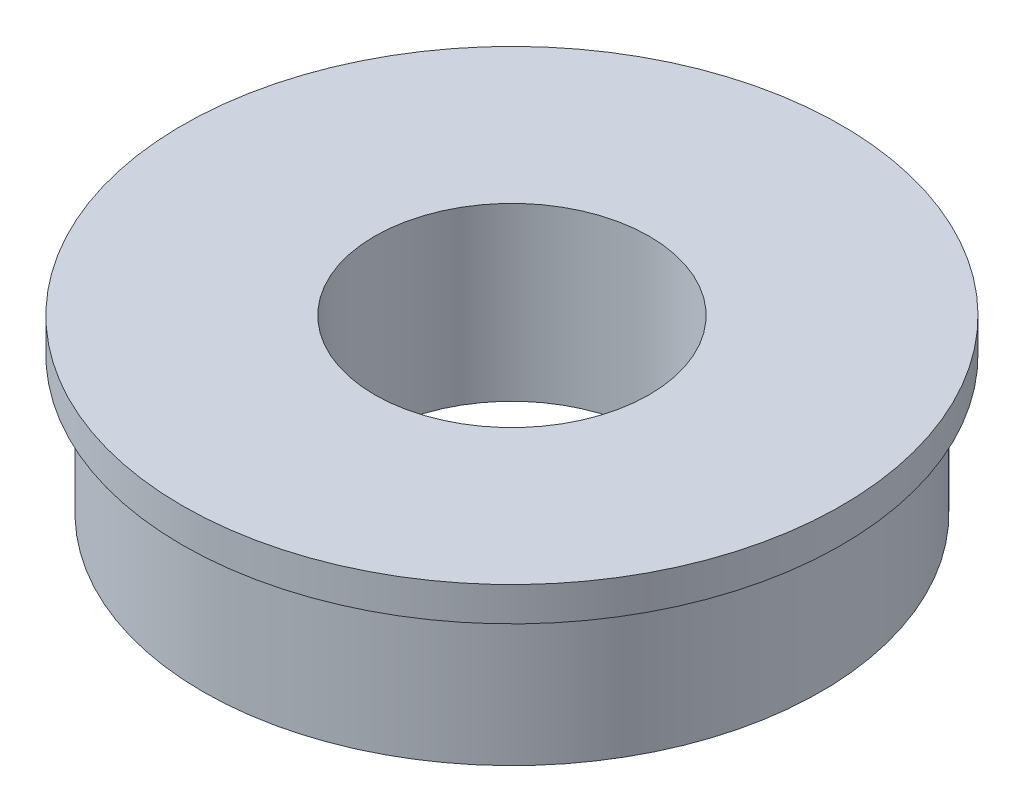
ISO-10303-21;
HEADER;
FILE_DESCRIPTION(('STEP AP214'),'2;1');
FILE_NAME('part.step','',(''),(''),'','','');
FILE_SCHEMA(('AUTOMOTIVE_DESIGN { 1 0 10303 214 1 1 1 1 }'));
ENDSEC;
DATA;
#1=APPLICATION_CONTEXT('core data for automotive mechanical design processes');
#2=APPLICATION_PROTOCOL_DEFINITION('international standard','automotive_design',2000,#1);
#3=PRODUCT_CONTEXT('',#1,'mechanical');
#4=PRODUCT('Part','Part','',(#3));
#5=PRODUCT_RELATED_PRODUCT_CATEGORY('part','',(#4));
#6=PRODUCT_DEFINITION_FORMATION('','',#4);
#7=PRODUCT_DEFINITION_CONTEXT('part definition',#1,'design');
#8=PRODUCT_DEFINITION('design','',#6,#7);
#9=PRODUCT_DEFINITION_SHAPE('','',#8);
#10=(LENGTH_UNIT() NAMED_UNIT(*) SI_UNIT(.MILLI.,.METRE.));
#11=(NAMED_UNIT(*) PLANE_ANGLE_UNIT() SI_UNIT($,.RADIAN.));
#12=(NAMED_UNIT(*) SI_UNIT($,.STERADIAN.) SOLID_ANGLE_UNIT());
#13=UNCERTAINTY_MEASURE_WITH_UNIT(LENGTH_MEASURE(1.E-05),#10,'distance_accuracy_value','');
#14=(GEOMETRIC_REPRESENTATION_CONTEXT(3) GLOBAL_UNCERTAINTY_ASSIGNED_CONTEXT((#13)) GLOBAL_UNIT_ASSIGNED_CONTEXT((#10,
#11,#12)) REPRESENTATION_CONTEXT('',''));
#15=CARTESIAN_POINT('',(0.,0.,0.));
#16=DIRECTION('',(0.,0.,1.));
#17=DIRECTION('',(1.,0.,0.));
#18=AXIS2_PLACEMENT_3D('',#15,#16,#17);
#19=CARTESIAN_POINT('',(0.,0.,0.));
#20=DIRECTION('',(0.,1.,0.));
#21=DIRECTION('',(0.,0.,1.));
#22=AXIS2_PLACEMENT_3D('',#19,#20,#21);
#23=PLANE('',#22);
#24=CARTESIAN_POINT('',(0.,0.,0.));
#25=DIRECTION('',(0.,1.,0.));
#26=DIRECTION('',(0.,0.,1.));
#27=AXIS2_PLACEMENT_3D('',#24,#25,#26);
#28=CIRCLE('',#27,14.2875);
#29=CARTESIAN_POINT('',(0.,0.,14.2875));
#30=VERTEX_POINT('',#29);
#31=EDGE_CURVE('E35',#30,#30,#28,.T.);
#32=ORIENTED_EDGE('',*,*,#31,.F.);
#33=EDGE_LOOP('',(#32));
#34=FACE_BOUND('',#33,.T.);
#35=CARTESIAN_POINT('',(0.,0.,0.));
#36=DIRECTION('',(0.,1.,0.));
#37=DIRECTION('',(0.,0.,1.));
#38=AXIS2_PLACEMENT_3D('',#35,#36,#37);
#39=CIRCLE('',#38,6.35);
#40=CARTESIAN_POINT('',(0.,0.,6.35));
#41=VERTEX_POINT('',#40);
#42=EDGE_CURVE('E42',#41,#41,#39,.T.);
#43=ORIENTED_EDGE('',*,*,#42,.T.);
#44=EDGE_LOOP('',(#43));
#45=FACE_BOUND('',#44,.T.);
#46=ADVANCED_FACE('F31',(#34,#45),#23,.F.);
#47=CARTESIAN_POINT('',(0.,6.35,0.));
#48=DIRECTION('',(0.,-1.,0.));
#49=DIRECTION('',(0.,0.,-1.));
#50=AXIS2_PLACEMENT_3D('',#47,#48,#49);
#51=CYLINDRICAL_SURFACE('',#50,14.2875);
#52=CARTESIAN_POINT('',(0.,6.35,0.));
#53=DIRECTION('',(0.,1.,0.));
#54=DIRECTION('',(0.,0.,1.));
#55=AXIS2_PLACEMENT_3D('',#52,#53,#54);
#56=CIRCLE('',#55,14.2875);
#57=CARTESIAN_POINT('',(0.,6.35,14.2875));
#58=VERTEX_POINT('',#57);
#59=EDGE_CURVE('E10',#58,#58,#56,.T.);
#60=ORIENTED_EDGE('',*,*,#59,.F.);
#61=EDGE_LOOP('',(#60));
#62=FACE_BOUND('',#61,.T.);
#63=ORIENTED_EDGE('',*,*,#31,.T.);
#64=EDGE_LOOP('',(#63));
#65=FACE_BOUND('',#64,.T.);
#66=ADVANCED_FACE('F33',(#62,#65),#51,.T.);
#67=CARTESIAN_POINT('',(0.,6.35,0.));
#68=DIRECTION('',(0.,-1.,0.));
#69=DIRECTION('',(0.,0.,-1.));
#70=AXIS2_PLACEMENT_3D('',#67,#68,#69);
#71=CYLINDRICAL_SURFACE('',#70,6.35);
#72=ORIENTED_EDGE('',*,*,#42,.F.);
#73=EDGE_LOOP('',(#72));
#74=FACE_BOUND('',#73,.T.);
#75=CARTESIAN_POINT('',(0.,7.9248,0.));
#76=DIRECTION('',(0.,1.,0.));
#77=DIRECTION('',(0.,0.,1.));
#78=AXIS2_PLACEMENT_3D('',#75,#76,#77);
#79=CIRCLE('',#78,6.35);
#80=CARTESIAN_POINT('',(0.,7.9248,6.35));
#81=VERTEX_POINT('',#80);
#82=EDGE_CURVE('E50',#81,#81,#79,.T.);
#83=ORIENTED_EDGE('',*,*,#82,.T.);
#84=EDGE_LOOP('',(#83));
#85=FACE_BOUND('',#84,.T.);
#86=ADVANCED_FACE('F56',(#74,#85),#71,.F.);
#87=CARTESIAN_POINT('',(0.,6.35,0.));
#88=DIRECTION('',(0.,1.,0.));
#89=DIRECTION('',(0.,0.,1.));
#90=AXIS2_PLACEMENT_3D('',#87,#88,#89);
#91=PLANE('',#90);
#92=CARTESIAN_POINT('',(0.,6.35,0.));
#93=DIRECTION('',(0.,1.,0.));
#94=DIRECTION('',(0.,0.,1.));
#95=AXIS2_PLACEMENT_3D('',#92,#93,#94);
#96=CIRCLE('',#95,15.24);
#97=CARTESIAN_POINT('',(0.,6.35,15.24));
#98=VERTEX_POINT('',#97);
#99=EDGE_CURVE('E47',#98,#98,#96,.T.);
#100=ORIENTED_EDGE('',*,*,#99,.F.);
#101=EDGE_LOOP('',(#100));
#102=FACE_BOUND('',#101,.T.);
#103=ORIENTED_EDGE('',*,*,#59,.T.);
#104=EDGE_LOOP('',(#103));
#105=FACE_BOUND('',#104,.T.);
#106=ADVANCED_FACE('F61',(#102,#105),#91,.F.);
#107=CARTESIAN_POINT('',(0.,7.9248,0.));
#108=DIRECTION('',(0.,1.,0.));
#109=DIRECTION('',(0.,0.,1.));
#110=AXIS2_PLACEMENT_3D('',#107,#108,#109);
#111=PLANE('',#110);
#112=CARTESIAN_POINT('',(0.,7.9248,0.));
#113=DIRECTION('',(0.,1.,0.));
#114=DIRECTION('',(0.,0.,1.));
#115=AXIS2_PLACEMENT_3D('',#112,#113,#114);
#116=CIRCLE('',#115,15.24);
#117=CARTESIAN_POINT('',(0.,7.9248,15.24));
#118=VERTEX_POINT('',#117);
#119=EDGE_CURVE('E46',#118,#118,#116,.T.);
#120=ORIENTED_EDGE('',*,*,#119,.T.);
#121=EDGE_LOOP('',(#120));
#122=FACE_BOUND('',#121,.T.);
#123=ORIENTED_EDGE('',*,*,#82,.F.);
#124=EDGE_LOOP('',(#123));
#125=FACE_BOUND('',#124,.T.);
#126=ADVANCED_FACE('F58',(#122,#125),#111,.T.);
#127=CARTESIAN_POINT('',(0.,7.9248,0.));
#128=DIRECTION('',(0.,-1.,0.));
#129=DIRECTION('',(0.,0.,-1.));
#130=AXIS2_PLACEMENT_3D('',#127,#128,#129);
#131=CYLINDRICAL_SURFACE('',#130,15.24);
#132=ORIENTED_EDGE('',*,*,#119,.F.);
#133=EDGE_LOOP('',(#132));
#134=FACE_BOUND('',#133,.T.);
#135=ORIENTED_EDGE('',*,*,#99,.T.);
#136=EDGE_LOOP('',(#135));
#137=FACE_BOUND('',#136,.T.);
#138=ADVANCED_FACE('F60',(#134,#137),#131,.T.);
#139=CLOSED_SHELL('',(#46,#66,#86,#106,#126,#138));
#140=MANIFOLD_SOLID_BREP('B2',#139);
#141=ADVANCED_BREP_SHAPE_REPRESENTATION('',(#18,#140),#14);
#142=SHAPE_DEFINITION_REPRESENTATION(#9,#141);
ENDSEC;
END-ISO-10303-21;
